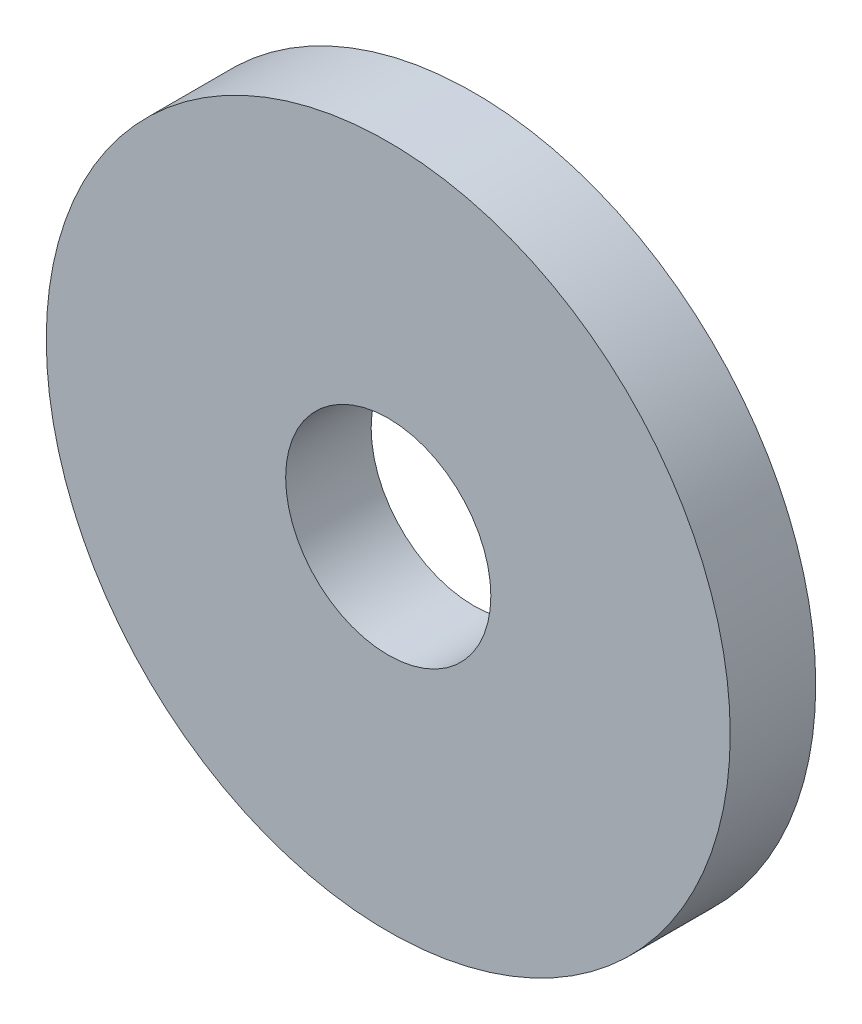
ISO-10303-21;
HEADER;
FILE_DESCRIPTION(('STEP AP214'),'2;1');
FILE_NAME('part.step','',(''),(''),'','','');
FILE_SCHEMA(('AUTOMOTIVE_DESIGN { 1 0 10303 214 1 1 1 1 }'));
ENDSEC;
DATA;
#1=APPLICATION_CONTEXT('core data for automotive mechanical design processes');
#2=APPLICATION_PROTOCOL_DEFINITION('international standard','automotive_design',2000,#1);
#3=PRODUCT_CONTEXT('',#1,'mechanical');
#4=PRODUCT('Part','Part','',(#3));
#5=PRODUCT_RELATED_PRODUCT_CATEGORY('part','',(#4));
#6=PRODUCT_DEFINITION_FORMATION('','',#4);
#7=PRODUCT_DEFINITION_CONTEXT('part definition',#1,'design');
#8=PRODUCT_DEFINITION('design','',#6,#7);
#9=PRODUCT_DEFINITION_SHAPE('','',#8);
#10=(LENGTH_UNIT() NAMED_UNIT(*) SI_UNIT(.MILLI.,.METRE.));
#11=(NAMED_UNIT(*) PLANE_ANGLE_UNIT() SI_UNIT($,.RADIAN.));
#12=(NAMED_UNIT(*) SI_UNIT($,.STERADIAN.) SOLID_ANGLE_UNIT());
#13=UNCERTAINTY_MEASURE_WITH_UNIT(LENGTH_MEASURE(1.E-05),#10,'distance_accuracy_value','');
#14=(GEOMETRIC_REPRESENTATION_CONTEXT(3) GLOBAL_UNCERTAINTY_ASSIGNED_CONTEXT((#13)) GLOBAL_UNIT_ASSIGNED_CONTEXT((#10,
#11,#12)) REPRESENTATION_CONTEXT('',''));
#15=CARTESIAN_POINT('',(0.,0.,0.));
#16=DIRECTION('',(0.,0.,1.));
#17=DIRECTION('',(1.,0.,0.));
#18=AXIS2_PLACEMENT_3D('',#15,#16,#17);
#19=CARTESIAN_POINT('',(0.,0.,0.));
#20=DIRECTION('',(0.,0.,1.));
#21=DIRECTION('',(1.,0.,0.));
#22=AXIS2_PLACEMENT_3D('',#19,#20,#21);
#23=PLANE('',#22);
#24=CARTESIAN_POINT('',(0.,0.,0.));
#25=DIRECTION('',(0.,0.,-1.));
#26=DIRECTION('',(-1.,0.,0.));
#27=AXIS2_PLACEMENT_3D('',#24,#25,#26);
#28=CIRCLE('',#27,1.2);
#29=CARTESIAN_POINT('',(-1.2,0.,0.));
#30=VERTEX_POINT('',#29);
#31=EDGE_CURVE('E27',#30,#30,#28,.F.);
#32=ORIENTED_EDGE('',*,*,#31,.T.);
#33=EDGE_LOOP('',(#32));
#34=FACE_BOUND('',#33,.T.);
#35=CARTESIAN_POINT('',(0.,0.,0.));
#36=DIRECTION('',(0.,0.,-1.));
#37=DIRECTION('',(-1.,0.,0.));
#38=AXIS2_PLACEMENT_3D('',#35,#36,#37);
#39=CIRCLE('',#38,4.);
#40=CARTESIAN_POINT('',(-4.,0.,0.));
#41=VERTEX_POINT('',#40);
#42=EDGE_CURVE('E18',#41,#41,#39,.F.);
#43=ORIENTED_EDGE('',*,*,#42,.F.);
#44=EDGE_LOOP('',(#43));
#45=FACE_BOUND('',#44,.T.);
#46=ADVANCED_FACE('F15',(#34,#45),#23,.F.);
#47=CARTESIAN_POINT('',(0.,0.,0.9));
#48=DIRECTION('',(0.,0.,-1.));
#49=DIRECTION('',(-1.,0.,0.));
#50=AXIS2_PLACEMENT_3D('',#47,#48,#49);
#51=CYLINDRICAL_SURFACE('',#50,4.);
#52=CARTESIAN_POINT('',(0.,0.,0.999999999999884));
#53=DIRECTION('',(0.,0.,-1.));
#54=DIRECTION('',(-1.,0.,0.));
#55=AXIS2_PLACEMENT_3D('',#52,#53,#54);
#56=CIRCLE('',#55,4.);
#57=CARTESIAN_POINT('',(-4.,0.,0.999999999999884));
#58=VERTEX_POINT('',#57);
#59=EDGE_CURVE('E22',#58,#58,#56,.F.);
#60=ORIENTED_EDGE('',*,*,#59,.F.);
#61=EDGE_LOOP('',(#60));
#62=FACE_BOUND('',#61,.T.);
#63=ORIENTED_EDGE('',*,*,#42,.T.);
#64=EDGE_LOOP('',(#63));
#65=FACE_BOUND('',#64,.T.);
#66=ADVANCED_FACE('F35',(#62,#65),#51,.T.);
#67=CARTESIAN_POINT('',(0.,0.,0.9));
#68=DIRECTION('',(0.,0.,-1.));
#69=DIRECTION('',(-1.,0.,0.));
#70=AXIS2_PLACEMENT_3D('',#67,#68,#69);
#71=CYLINDRICAL_SURFACE('',#70,1.2);
#72=ORIENTED_EDGE('',*,*,#31,.F.);
#73=EDGE_LOOP('',(#72));
#74=FACE_BOUND('',#73,.T.);
#75=CARTESIAN_POINT('',(0.,0.,0.999999999999883));
#76=DIRECTION('',(0.,0.,-1.));
#77=DIRECTION('',(-1.,0.,0.));
#78=AXIS2_PLACEMENT_3D('',#75,#76,#77);
#79=CIRCLE('',#78,1.2);
#80=CARTESIAN_POINT('',(-1.2,0.,0.999999999999883));
#81=VERTEX_POINT('',#80);
#82=EDGE_CURVE('E10',#81,#81,#79,.T.);
#83=ORIENTED_EDGE('',*,*,#82,.F.);
#84=EDGE_LOOP('',(#83));
#85=FACE_BOUND('',#84,.T.);
#86=ADVANCED_FACE('F42',(#74,#85),#71,.F.);
#87=CARTESIAN_POINT('',(0.,0.,0.999999999999883));
#88=DIRECTION('',(0.,0.,1.));
#89=DIRECTION('',(1.,0.,0.));
#90=AXIS2_PLACEMENT_3D('',#87,#88,#89);
#91=PLANE('',#90);
#92=ORIENTED_EDGE('',*,*,#82,.T.);
#93=EDGE_LOOP('',(#92));
#94=FACE_BOUND('',#93,.T.);
#95=ORIENTED_EDGE('',*,*,#59,.T.);
#96=EDGE_LOOP('',(#95));
#97=FACE_BOUND('',#96,.T.);
#98=ADVANCED_FACE('F44',(#94,#97),#91,.T.);
#99=CLOSED_SHELL('',(#46,#66,#86,#98));
#100=MANIFOLD_SOLID_BREP('B1',#99);
#101=ADVANCED_BREP_SHAPE_REPRESENTATION('',(#18,#100),#14);
#102=SHAPE_DEFINITION_REPRESENTATION(#9,#101);
ENDSEC;
END-ISO-10303-21;
